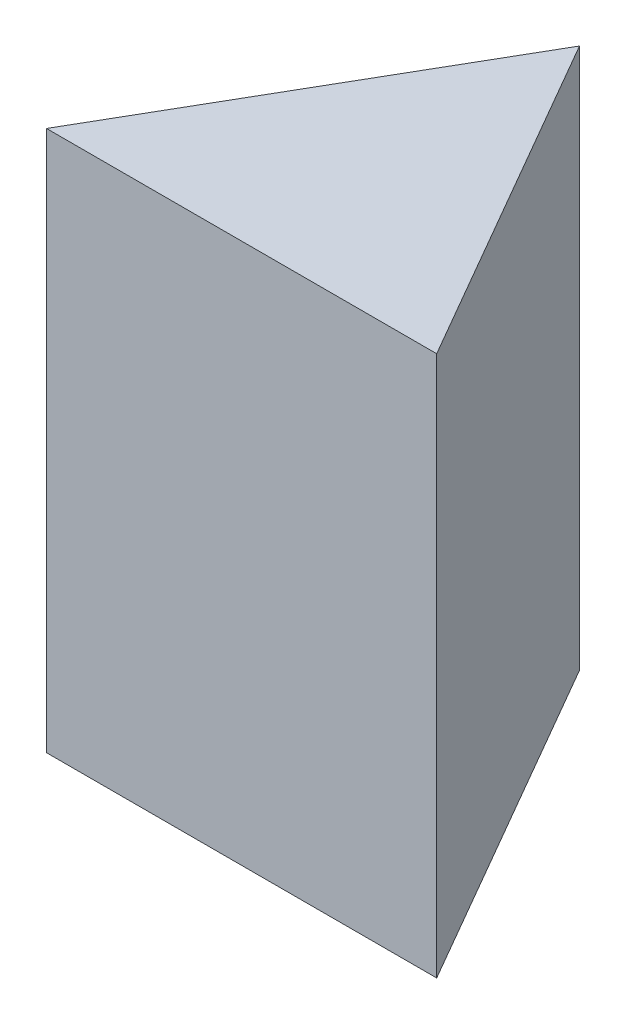
ISO-10303-21;
HEADER;
FILE_DESCRIPTION(('STEP AP214'),'2;1');
FILE_NAME('part.step','',(''),(''),'','','');
FILE_SCHEMA(('AUTOMOTIVE_DESIGN { 1 0 10303 214 1 1 1 1 }'));
ENDSEC;
DATA;
#1=APPLICATION_CONTEXT('core data for automotive mechanical design processes');
#2=APPLICATION_PROTOCOL_DEFINITION('international standard','automotive_design',2000,#1);
#3=PRODUCT_CONTEXT('',#1,'mechanical');
#4=PRODUCT('Part','Part','',(#3));
#5=PRODUCT_RELATED_PRODUCT_CATEGORY('part','',(#4));
#6=PRODUCT_DEFINITION_FORMATION('','',#4);
#7=PRODUCT_DEFINITION_CONTEXT('part definition',#1,'design');
#8=PRODUCT_DEFINITION('design','',#6,#7);
#9=PRODUCT_DEFINITION_SHAPE('','',#8);
#10=(LENGTH_UNIT() NAMED_UNIT(*) SI_UNIT(.MILLI.,.METRE.));
#11=(NAMED_UNIT(*) PLANE_ANGLE_UNIT() SI_UNIT($,.RADIAN.));
#12=(NAMED_UNIT(*) SI_UNIT($,.STERADIAN.) SOLID_ANGLE_UNIT());
#13=UNCERTAINTY_MEASURE_WITH_UNIT(LENGTH_MEASURE(1.E-05),#10,'distance_accuracy_value','');
#14=(GEOMETRIC_REPRESENTATION_CONTEXT(3) GLOBAL_UNCERTAINTY_ASSIGNED_CONTEXT((#13)) GLOBAL_UNIT_ASSIGNED_CONTEXT((#10,
#11,#12)) REPRESENTATION_CONTEXT('',''));
#15=CARTESIAN_POINT('',(0.,0.,0.));
#16=DIRECTION('',(0.,0.,1.));
#17=DIRECTION('',(1.,0.,0.));
#18=AXIS2_PLACEMENT_3D('',#15,#16,#17);
#19=CARTESIAN_POINT('',(-16.2379763209582,60.,-9.375));
#20=DIRECTION('',(-0.866025403784439,0.,-0.5));
#21=DIRECTION('',(-0.5,0.,0.866025403784439));
#22=AXIS2_PLACEMENT_3D('',#19,#20,#21);
#23=PLANE('',#22);
#24=DIRECTION('',(0.5,0.,-0.866025403784439));
#25=VECTOR('',#24,1.);
#26=CARTESIAN_POINT('',(-16.2379763209582,0.,-9.375));
#27=LINE('',#26,#25);
#28=CARTESIAN_POINT('',(-21.650635094611,0.,0.));
#29=VERTEX_POINT('',#28);
#30=CARTESIAN_POINT('',(0.,0.,-37.5));
#31=VERTEX_POINT('',#30);
#32=EDGE_CURVE('E83',#29,#31,#27,.T.);
#33=ORIENTED_EDGE('',*,*,#32,.F.);
#34=DIRECTION('',(0.,-1.,0.));
#35=VECTOR('',#34,1.);
#36=CARTESIAN_POINT('',(-21.650635094611,60.,0.));
#37=LINE('',#36,#35);
#38=CARTESIAN_POINT('',(-21.650635094611,60.,0.));
#39=VERTEX_POINT('',#38);
#40=EDGE_CURVE('E11',#39,#29,#37,.T.);
#41=ORIENTED_EDGE('',*,*,#40,.F.);
#42=DIRECTION('',(0.5,0.,-0.866025403784439));
#43=VECTOR('',#42,1.);
#44=CARTESIAN_POINT('',(-16.2379763209582,60.,-9.375));
#45=LINE('',#44,#43);
#46=CARTESIAN_POINT('',(0.,60.,-37.5));
#47=VERTEX_POINT('',#46);
#48=EDGE_CURVE('E81',#39,#47,#45,.T.);
#49=ORIENTED_EDGE('',*,*,#48,.T.);
#50=DIRECTION('',(0.,-1.,0.));
#51=VECTOR('',#50,1.);
#52=CARTESIAN_POINT('',(0.,60.,-37.5));
#53=LINE('',#52,#51);
#54=EDGE_CURVE('E77',#47,#31,#53,.T.);
#55=ORIENTED_EDGE('',*,*,#54,.T.);
#56=EDGE_LOOP('',(#33,#41,#49,#55));
#57=FACE_BOUND('',#56,.T.);
#58=ADVANCED_FACE('F43',(#57),#23,.T.);
#59=CARTESIAN_POINT('',(0.,60.,0.));
#60=DIRECTION('',(0.,0.,-1.));
#61=DIRECTION('',(-1.,0.,0.));
#62=AXIS2_PLACEMENT_3D('',#59,#60,#61);
#63=PLANE('',#62);
#64=DIRECTION('',(1.,0.,0.));
#65=VECTOR('',#64,1.);
#66=CARTESIAN_POINT('',(0.,0.,0.));
#67=LINE('',#66,#65);
#68=CARTESIAN_POINT('',(21.650635094611,0.,0.));
#69=VERTEX_POINT('',#68);
#70=EDGE_CURVE('E71',#29,#69,#67,.T.);
#71=ORIENTED_EDGE('',*,*,#70,.T.);
#72=DIRECTION('',(0.,-1.,0.));
#73=VECTOR('',#72,1.);
#74=CARTESIAN_POINT('',(21.650635094611,60.,0.));
#75=LINE('',#74,#73);
#76=CARTESIAN_POINT('',(21.650635094611,60.,0.));
#77=VERTEX_POINT('',#76);
#78=EDGE_CURVE('E51',#77,#69,#75,.T.);
#79=ORIENTED_EDGE('',*,*,#78,.F.);
#80=DIRECTION('',(1.,0.,0.));
#81=VECTOR('',#80,1.);
#82=CARTESIAN_POINT('',(0.,60.,0.));
#83=LINE('',#82,#81);
#84=EDGE_CURVE('E84',#39,#77,#83,.T.);
#85=ORIENTED_EDGE('',*,*,#84,.F.);
#86=ORIENTED_EDGE('',*,*,#40,.T.);
#87=EDGE_LOOP('',(#71,#79,#85,#86));
#88=FACE_BOUND('',#87,.T.);
#89=ADVANCED_FACE('F85',(#88),#63,.F.);
#90=CARTESIAN_POINT('',(16.2379763209582,60.,-9.375));
#91=DIRECTION('',(-0.866025403784439,0.,0.5));
#92=DIRECTION('',(0.5,0.,0.866025403784439));
#93=AXIS2_PLACEMENT_3D('',#90,#91,#92);
#94=PLANE('',#93);
#95=DIRECTION('',(-0.5,0.,-0.866025403784439));
#96=VECTOR('',#95,1.);
#97=CARTESIAN_POINT('',(16.2379763209582,0.,-9.375));
#98=LINE('',#97,#96);
#99=EDGE_CURVE('E88',#69,#31,#98,.T.);
#100=ORIENTED_EDGE('',*,*,#99,.T.);
#101=ORIENTED_EDGE('',*,*,#54,.F.);
#102=DIRECTION('',(-0.5,0.,-0.866025403784439));
#103=VECTOR('',#102,1.);
#104=CARTESIAN_POINT('',(16.2379763209582,60.,-9.375));
#105=LINE('',#104,#103);
#106=EDGE_CURVE('E59',#77,#47,#105,.T.);
#107=ORIENTED_EDGE('',*,*,#106,.F.);
#108=ORIENTED_EDGE('',*,*,#78,.T.);
#109=EDGE_LOOP('',(#100,#101,#107,#108));
#110=FACE_BOUND('',#109,.T.);
#111=ADVANCED_FACE('F97',(#110),#94,.F.);
#112=CARTESIAN_POINT('',(0.,60.,0.));
#113=DIRECTION('',(0.,1.,0.));
#114=DIRECTION('',(0.,0.,1.));
#115=AXIS2_PLACEMENT_3D('',#112,#113,#114);
#116=PLANE('',#115);
#117=ORIENTED_EDGE('',*,*,#48,.F.);
#118=ORIENTED_EDGE('',*,*,#84,.T.);
#119=ORIENTED_EDGE('',*,*,#106,.T.);
#120=EDGE_LOOP('',(#117,#118,#119));
#121=FACE_BOUND('',#120,.T.);
#122=ADVANCED_FACE('F87',(#121),#116,.T.);
#123=CARTESIAN_POINT('',(0.,0.,0.));
#124=DIRECTION('',(0.,1.,0.));
#125=DIRECTION('',(0.,0.,1.));
#126=AXIS2_PLACEMENT_3D('',#123,#124,#125);
#127=PLANE('',#126);
#128=ORIENTED_EDGE('',*,*,#32,.T.);
#129=ORIENTED_EDGE('',*,*,#99,.F.);
#130=ORIENTED_EDGE('',*,*,#70,.F.);
#131=EDGE_LOOP('',(#128,#129,#130));
#132=FACE_BOUND('',#131,.T.);
#133=ADVANCED_FACE('F99',(#132),#127,.F.);
#134=CLOSED_SHELL('',(#58,#89,#111,#122,#133));
#135=MANIFOLD_SOLID_BREP('B2',#134);
#136=ADVANCED_BREP_SHAPE_REPRESENTATION('',(#18,#135),#14);
#137=SHAPE_DEFINITION_REPRESENTATION(#9,#136);
ENDSEC;
END-ISO-10303-21;
